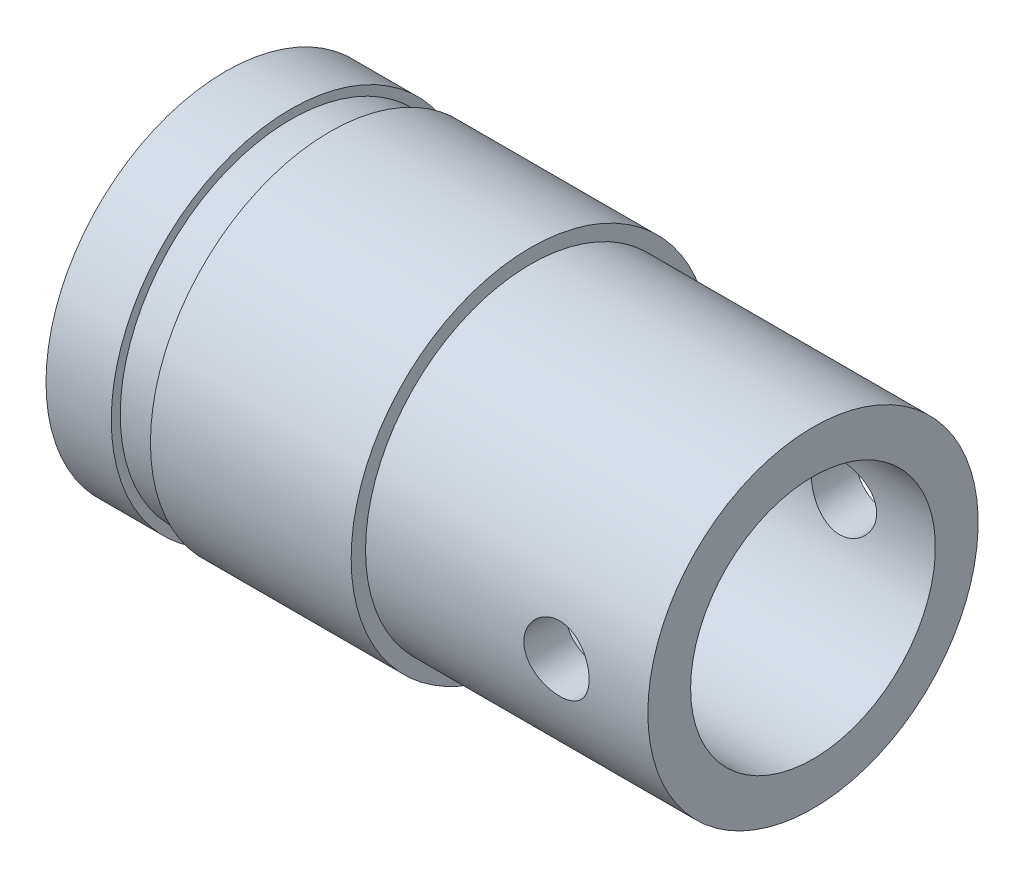
ISO-10303-21;
HEADER;
FILE_DESCRIPTION(('STEP AP214'),'2;1');
FILE_NAME('part.step','',(''),(''),'','','');
FILE_SCHEMA(('AUTOMOTIVE_DESIGN { 1 0 10303 214 1 1 1 1 }'));
ENDSEC;
DATA;
#1=APPLICATION_CONTEXT('core data for automotive mechanical design processes');
#2=APPLICATION_PROTOCOL_DEFINITION('international standard','automotive_design',2000,#1);
#3=PRODUCT_CONTEXT('',#1,'mechanical');
#4=PRODUCT('Part','Part','',(#3));
#5=PRODUCT_RELATED_PRODUCT_CATEGORY('part','',(#4));
#6=PRODUCT_DEFINITION_FORMATION('','',#4);
#7=PRODUCT_DEFINITION_CONTEXT('part definition',#1,'design');
#8=PRODUCT_DEFINITION('design','',#6,#7);
#9=PRODUCT_DEFINITION_SHAPE('','',#8);
#10=(LENGTH_UNIT() NAMED_UNIT(*) SI_UNIT(.MILLI.,.METRE.));
#11=(NAMED_UNIT(*) PLANE_ANGLE_UNIT() SI_UNIT($,.RADIAN.));
#12=(NAMED_UNIT(*) SI_UNIT($,.STERADIAN.) SOLID_ANGLE_UNIT());
#13=UNCERTAINTY_MEASURE_WITH_UNIT(LENGTH_MEASURE(1.E-05),#10,'distance_accuracy_value','');
#14=(GEOMETRIC_REPRESENTATION_CONTEXT(3) GLOBAL_UNCERTAINTY_ASSIGNED_CONTEXT((#13)) GLOBAL_UNIT_ASSIGNED_CONTEXT((#10,
#11,#12)) REPRESENTATION_CONTEXT('',''));
#15=CARTESIAN_POINT('',(0.,0.,0.));
#16=DIRECTION('',(0.,0.,1.));
#17=DIRECTION('',(1.,0.,0.));
#18=AXIS2_PLACEMENT_3D('',#15,#16,#17);
#19=CARTESIAN_POINT('',(0.,5.5,0.));
#20=DIRECTION('',(1.,0.,0.));
#21=DIRECTION('',(0.,0.,-1.));
#22=AXIS2_PLACEMENT_3D('',#19,#20,#21);
#23=PLANE('',#22);
#24=CARTESIAN_POINT('',(0.,0.,0.));
#25=DIRECTION('',(-1.,0.,0.));
#26=DIRECTION('',(0.,0.,1.));
#27=AXIS2_PLACEMENT_3D('',#24,#25,#26);
#28=CIRCLE('',#27,4.75);
#29=CARTESIAN_POINT('',(0.,0.,4.75));
#30=VERTEX_POINT('',#29);
#31=EDGE_CURVE('E10',#30,#30,#28,.T.);
#32=ORIENTED_EDGE('',*,*,#31,.F.);
#33=EDGE_LOOP('',(#32));
#34=FACE_BOUND('',#33,.T.);
#35=CARTESIAN_POINT('',(0.,0.,0.));
#36=DIRECTION('',(-1.,0.,0.));
#37=DIRECTION('',(0.,0.,1.));
#38=AXIS2_PLACEMENT_3D('',#35,#36,#37);
#39=CIRCLE('',#38,5.5);
#40=CARTESIAN_POINT('',(0.,0.,5.5));
#41=VERTEX_POINT('',#40);
#42=EDGE_CURVE('E107',#41,#41,#39,.T.);
#43=ORIENTED_EDGE('',*,*,#42,.T.);
#44=EDGE_LOOP('',(#43));
#45=FACE_BOUND('',#44,.T.);
#46=ADVANCED_FACE('F30',(#34,#45),#23,.F.);
#47=CARTESIAN_POINT('',(0.,0.,0.));
#48=DIRECTION('',(-1.,0.,0.));
#49=DIRECTION('',(0.,0.,1.));
#50=AXIS2_PLACEMENT_3D('',#47,#48,#49);
#51=CYLINDRICAL_SURFACE('',#50,4.75);
#52=CARTESIAN_POINT('',(6.1,0.,0.));
#53=DIRECTION('',(-1.,0.,0.));
#54=DIRECTION('',(0.,0.,1.));
#55=AXIS2_PLACEMENT_3D('',#52,#53,#54);
#56=CIRCLE('',#55,4.75);
#57=CARTESIAN_POINT('',(6.1,0.,4.75));
#58=VERTEX_POINT('',#57);
#59=EDGE_CURVE('E42',#58,#58,#56,.T.);
#60=ORIENTED_EDGE('',*,*,#59,.F.);
#61=EDGE_LOOP('',(#60));
#62=FACE_BOUND('',#61,.T.);
#63=ORIENTED_EDGE('',*,*,#31,.T.);
#64=EDGE_LOOP('',(#63));
#65=FACE_BOUND('',#64,.T.);
#66=ADVANCED_FACE('F92',(#62,#65),#51,.F.);
#67=CARTESIAN_POINT('',(6.1,4.75,0.));
#68=DIRECTION('',(1.,0.,0.));
#69=DIRECTION('',(0.,0.,-1.));
#70=AXIS2_PLACEMENT_3D('',#67,#68,#69);
#71=PLANE('',#70);
#72=CARTESIAN_POINT('',(6.1,0.,0.));
#73=DIRECTION('',(-1.,0.,0.));
#74=DIRECTION('',(0.,0.,1.));
#75=AXIS2_PLACEMENT_3D('',#72,#73,#74);
#76=CIRCLE('',#75,3.75);
#77=CARTESIAN_POINT('',(6.1,0.,3.75));
#78=VERTEX_POINT('',#77);
#79=EDGE_CURVE('E47',#78,#78,#76,.T.);
#80=ORIENTED_EDGE('',*,*,#79,.F.);
#81=EDGE_LOOP('',(#80));
#82=FACE_BOUND('',#81,.T.);
#83=ORIENTED_EDGE('',*,*,#59,.T.);
#84=EDGE_LOOP('',(#83));
#85=FACE_BOUND('',#84,.T.);
#86=ADVANCED_FACE('F88',(#82,#85),#71,.F.);
#87=CARTESIAN_POINT('',(0.,0.,0.));
#88=DIRECTION('',(-1.,0.,0.));
#89=DIRECTION('',(0.,0.,1.));
#90=AXIS2_PLACEMENT_3D('',#87,#88,#89);
#91=CYLINDRICAL_SURFACE('',#90,3.75);
#92=CARTESIAN_POINT('',(16.2,0.,3.75));
#93=CARTESIAN_POINT('',(16.1999986915326,0.0551272779164272,3.74999916905081));
#94=CARTESIAN_POINT('',(16.1954261929052,0.11026858011092,3.74877243081077));
#95=CARTESIAN_POINT('',(16.1772893846307,0.218962725677232,3.74399786810828));
#96=CARTESIAN_POINT('',(16.1637207477869,0.272514791659543,3.74044892666287));
#97=CARTESIAN_POINT('',(16.128064166568,0.376445794522657,3.73142166626401));
#98=CARTESIAN_POINT('',(16.105987206167,0.426828725507644,3.72594583565211));
#99=CARTESIAN_POINT('',(16.0539813786667,0.523176843196329,3.71364349575816));
#100=CARTESIAN_POINT('',(16.0240519883204,0.56914173522481,3.70681689647503));
#101=CARTESIAN_POINT('',(15.9564582417933,0.656414751870012,3.69237307451086));
#102=CARTESIAN_POINT('',(15.9186456659958,0.697605844931407,3.68474233839675));
#103=CARTESIAN_POINT('',(15.8366757584684,0.773143568303175,3.66963704839461));
#104=CARTESIAN_POINT('',(15.7925176111916,0.807489317478271,3.66216251472373));
#105=CARTESIAN_POINT('',(15.6981758825869,0.86893204621713,3.64807768733456));
#106=CARTESIAN_POINT('',(15.6479018358676,0.895894388682637,3.64148444286396));
#107=CARTESIAN_POINT('',(15.5433299444553,0.940937740384772,3.63010738654318));
#108=CARTESIAN_POINT('',(15.4890328438399,0.959020387256103,3.625323241088));
#109=CARTESIAN_POINT('',(15.3792522310867,0.985384601132128,3.61824557918659));
#110=CARTESIAN_POINT('',(15.3238232300239,0.993878351224682,3.61589823970153));
#111=CARTESIAN_POINT('',(15.2122811583335,1.00148517353046,3.61379915522345));
#112=CARTESIAN_POINT('',(15.1561682174822,1.00059999852868,3.61404692524201));
#113=CARTESIAN_POINT('',(15.0465072923138,0.989642550013106,3.61706189384523));
#114=CARTESIAN_POINT('',(14.992931408981,0.97982703032372,3.61975867751345));
#115=CARTESIAN_POINT('',(14.8882158327716,0.95169874361102,3.62725506544765));
#116=CARTESIAN_POINT('',(14.8370763349623,0.933385297465003,3.63205483777497));
#117=CARTESIAN_POINT('',(14.7380159280958,0.888571784826252,3.64327830872989));
#118=CARTESIAN_POINT('',(14.6901378303569,0.861981705688916,3.64971971409028));
#119=CARTESIAN_POINT('',(14.5994329205742,0.801432519118897,3.66349114821545));
#120=CARTESIAN_POINT('',(14.5566071054218,0.76747196112126,3.67082135177681));
#121=CARTESIAN_POINT('',(14.4757555012726,0.691833036317094,3.68583755314841));
#122=CARTESIAN_POINT('',(14.4379318408425,0.649939063641496,3.69352735744391));
#123=CARTESIAN_POINT('',(14.3698056098249,0.560308834103188,3.70818190638182));
#124=CARTESIAN_POINT('',(14.3395033356488,0.512572347102546,3.71514662244284));
#125=CARTESIAN_POINT('',(14.2871910485877,0.412299127748726,3.7276091019914));
#126=CARTESIAN_POINT('',(14.2652176147757,0.359742451275895,3.73310036416778));
#127=CARTESIAN_POINT('',(14.2304764055933,0.251501147195198,3.74195022200501));
#128=CARTESIAN_POINT('',(14.217706618638,0.195817205964161,3.74530928366875));
#129=CARTESIAN_POINT('',(14.2020525615411,0.0846270415727573,3.74944579279192));
#130=CARTESIAN_POINT('',(14.1988934800746,0.0291621188206898,3.75029498735481));
#131=CARTESIAN_POINT('',(14.2017915821235,-0.0815050229505989,3.74952235845846));
#132=CARTESIAN_POINT('',(14.2078478130529,-0.136707268531056,3.74790079040171));
#133=CARTESIAN_POINT('',(14.22877922373,-0.244301224950891,3.74241517748015));
#134=CARTESIAN_POINT('',(14.2435011230989,-0.296724926013895,3.73859013273183));
#135=CARTESIAN_POINT('',(14.281167972254,-0.398353485588028,3.72913147447051));
#136=CARTESIAN_POINT('',(14.3041138131252,-0.447557994607999,3.72349766498012));
#137=CARTESIAN_POINT('',(14.3580869435903,-0.542419237333991,3.71087830279834));
#138=CARTESIAN_POINT('',(14.389263733399,-0.587987594230651,3.70386843302742));
#139=CARTESIAN_POINT('',(14.4586258150788,-0.673342317698515,3.68930726182519));
#140=CARTESIAN_POINT('',(14.4968124912999,-0.713127539399372,3.68175585362777));
#141=CARTESIAN_POINT('',(14.5803927887479,-0.786944622394094,3.66669872934363));
#142=CARTESIAN_POINT('',(14.6259592807001,-0.82078259624993,3.65920030718477));
#143=CARTESIAN_POINT('',(14.7222823480473,-0.880335955924744,3.64533223587543));
#144=CARTESIAN_POINT('',(14.7730387068019,-0.906051680607636,3.63896253963886));
#145=CARTESIAN_POINT('',(14.8780476535441,-0.948437057932432,3.62814634200825));
#146=CARTESIAN_POINT('',(14.9322779059366,-0.965159061279489,3.62368874211867));
#147=CARTESIAN_POINT('',(15.0429196598669,-0.989206025603967,3.61719912616095));
#148=CARTESIAN_POINT('',(15.0993306001835,-0.996533388014941,3.6151664902391));
#149=CARTESIAN_POINT('',(15.2107473939363,-1.00144494826627,3.61380872273343));
#150=CARTESIAN_POINT('',(15.2657386601276,-0.999340778089927,3.61439698868016));
#151=CARTESIAN_POINT('',(15.3745517570065,-0.986171880002813,3.61801198044147));
#152=CARTESIAN_POINT('',(15.4283736177507,-0.975107382675293,3.62103864350681));
#153=CARTESIAN_POINT('',(15.5329278760645,-0.944512578498334,3.62913785535624));
#154=CARTESIAN_POINT('',(15.583680921366,-0.925048305377857,3.63419442509566));
#155=CARTESIAN_POINT('',(15.6812394152672,-0.878257772811975,3.64578409068345));
#156=CARTESIAN_POINT('',(15.7280442431503,-0.850930280123096,3.65231741810751));
#157=CARTESIAN_POINT('',(15.8178651797483,-0.788244546344072,3.66636460720159));
#158=CARTESIAN_POINT('',(15.8607292674881,-0.752673648839545,3.67390166550826));
#159=CARTESIAN_POINT('',(15.9399812258337,-0.674915267555504,3.68897751891523));
#160=CARTESIAN_POINT('',(15.9763675193344,-0.632726177179375,3.69651631399226));
#161=CARTESIAN_POINT('',(16.0423961188234,-0.541839990544342,3.71093906201979));
#162=CARTESIAN_POINT('',(16.0718775053247,-0.49302298087589,3.71780555657274));
#163=CARTESIAN_POINT('',(16.1221687079647,-0.390944320208445,3.7299190505145));
#164=CARTESIAN_POINT('',(16.1429840878318,-0.337685547348149,3.73516708841797));
#165=CARTESIAN_POINT('',(16.1726376427078,-0.237187352440496,3.74277376256734));
#166=CARTESIAN_POINT('',(16.1828746917962,-0.190381008282518,3.74546385296301));
#167=CARTESIAN_POINT('',(16.1965561030835,-0.0957198976585382,3.74907724518228));
#168=CARTESIAN_POINT('',(16.2000011361,-0.0478652352024302,3.75000072148635));
#169=CARTESIAN_POINT('',(16.2,0.,3.75));
#170=B_SPLINE_CURVE_WITH_KNOTS('',3,(#92,#93,#94,#95,#96,#97,#98,#99,#100,#101,#102,#103,#104,
#105,#106,#107,#108,#109,#110,#111,#112,#113,#114,#115,#116,#117,#118,#119,#120,#121,#122,#123,
#124,#125,#126,#127,#128,#129,#130,#131,#132,#133,#134,#135,#136,#137,#138,#139,#140,#141,#142,
#143,#144,#145,#146,#147,#148,#149,#150,#151,#152,#153,#154,#155,#156,#157,#158,#159,#160,#161,
#162,#163,#164,#165,#166,#167,#168,#169),.UNSPECIFIED.,.T.,.F.,(4,2,2,2,2,2,2,2,2,2,2,2,2,2,2,2,
2,2,2,2,2,2,2,2,2,2,2,2,2,2,2,2,2,2,2,2,2,2,4),(0.,0.165206299474785,0.330492121880725,
0.495565276485966,0.660649433543376,0.829174489774837,0.997721224625745,1.16916291261615,
1.3405729706485,1.50811079123795,1.67561730199242,1.83845501020081,2.00130573403552,
2.16599336670331,2.33071344055897,2.50080629903243,2.67090585965881,2.84174404798603,
3.01254488592152,3.17841358759356,3.34426514459758,3.5072676781814,3.6702878788489,
3.83650142999358,4.00274784126526,4.17368248188477,4.34460999009136,4.51453148845744,
4.68440954326914,4.84871671196728,5.01301965255219,5.17605382719074,5.33911358556424,
5.50697169780617,5.67487062161147,5.84636126135371,6.01774163067513,6.16119909491591,
6.30464238978114),.UNSPECIFIED.);
#171=CARTESIAN_POINT('',(16.2,0.,3.75));
#172=VERTEX_POINT('',#171);
#173=EDGE_CURVE('E78',#172,#172,#170,.T.);
#174=ORIENTED_EDGE('',*,*,#173,.T.);
#175=EDGE_LOOP('',(#174));
#176=FACE_BOUND('',#175,.T.);
#177=CARTESIAN_POINT('',(16.2,0.,-3.75));
#178=CARTESIAN_POINT('',(16.1999986915326,-0.0551272779164272,-3.74999916905081));
#179=CARTESIAN_POINT('',(16.1954261929052,-0.11026858011092,-3.74877243081077));
#180=CARTESIAN_POINT('',(16.1772893846307,-0.218962725677232,-3.74399786810828));
#181=CARTESIAN_POINT('',(16.1637207477869,-0.272514791659543,-3.74044892666287));
#182=CARTESIAN_POINT('',(16.128064166568,-0.376445794522657,-3.73142166626401));
#183=CARTESIAN_POINT('',(16.105987206167,-0.426828725507644,-3.72594583565211));
#184=CARTESIAN_POINT('',(16.0539813786667,-0.523176843196329,-3.71364349575816));
#185=CARTESIAN_POINT('',(16.0240519883204,-0.56914173522481,-3.70681689647503));
#186=CARTESIAN_POINT('',(15.9564582417933,-0.656414751870012,-3.69237307451086));
#187=CARTESIAN_POINT('',(15.9186456659958,-0.697605844931407,-3.68474233839675));
#188=CARTESIAN_POINT('',(15.8366757584684,-0.773143568303175,-3.66963704839461));
#189=CARTESIAN_POINT('',(15.7925176111916,-0.807489317478271,-3.66216251472373));
#190=CARTESIAN_POINT('',(15.6981758825869,-0.86893204621713,-3.64807768733456));
#191=CARTESIAN_POINT('',(15.6479018358676,-0.895894388682637,-3.64148444286396));
#192=CARTESIAN_POINT('',(15.5433299444553,-0.940937740384772,-3.63010738654318));
#193=CARTESIAN_POINT('',(15.4890328438399,-0.959020387256103,-3.625323241088));
#194=CARTESIAN_POINT('',(15.3792522310867,-0.985384601132128,-3.61824557918659));
#195=CARTESIAN_POINT('',(15.3238232300239,-0.993878351224682,-3.61589823970153));
#196=CARTESIAN_POINT('',(15.2122811583335,-1.00148517353046,-3.61379915522345));
#197=CARTESIAN_POINT('',(15.1561682174822,-1.00059999852868,-3.61404692524201));
#198=CARTESIAN_POINT('',(15.0465072923138,-0.989642550013106,-3.61706189384523));
#199=CARTESIAN_POINT('',(14.992931408981,-0.97982703032372,-3.61975867751345));
#200=CARTESIAN_POINT('',(14.8882158327716,-0.95169874361102,-3.62725506544765));
#201=CARTESIAN_POINT('',(14.8370763349623,-0.933385297465003,-3.63205483777497));
#202=CARTESIAN_POINT('',(14.7380159280958,-0.888571784826252,-3.64327830872989));
#203=CARTESIAN_POINT('',(14.6901378303569,-0.861981705688916,-3.64971971409028));
#204=CARTESIAN_POINT('',(14.5994329205742,-0.801432519118897,-3.66349114821545));
#205=CARTESIAN_POINT('',(14.5566071054218,-0.76747196112126,-3.67082135177681));
#206=CARTESIAN_POINT('',(14.4757555012726,-0.691833036317094,-3.68583755314841));
#207=CARTESIAN_POINT('',(14.4379318408425,-0.649939063641496,-3.69352735744391));
#208=CARTESIAN_POINT('',(14.3698056098249,-0.560308834103188,-3.70818190638182));
#209=CARTESIAN_POINT('',(14.3395033356488,-0.512572347102546,-3.71514662244284));
#210=CARTESIAN_POINT('',(14.2871910485877,-0.412299127748726,-3.7276091019914));
#211=CARTESIAN_POINT('',(14.2652176147757,-0.359742451275895,-3.73310036416778));
#212=CARTESIAN_POINT('',(14.2304764055933,-0.251501147195198,-3.74195022200501));
#213=CARTESIAN_POINT('',(14.217706618638,-0.195817205964161,-3.74530928366875));
#214=CARTESIAN_POINT('',(14.2020525615411,-0.0846270415727573,-3.74944579279192));
#215=CARTESIAN_POINT('',(14.1988934800746,-0.0291621188206898,-3.75029498735481));
#216=CARTESIAN_POINT('',(14.2017915821235,0.0815050229505989,-3.74952235845846));
#217=CARTESIAN_POINT('',(14.2078478130529,0.136707268531056,-3.74790079040171));
#218=CARTESIAN_POINT('',(14.22877922373,0.244301224950891,-3.74241517748015));
#219=CARTESIAN_POINT('',(14.2435011230989,0.296724926013895,-3.73859013273183));
#220=CARTESIAN_POINT('',(14.281167972254,0.398353485588028,-3.72913147447051));
#221=CARTESIAN_POINT('',(14.3041138131252,0.447557994607999,-3.72349766498012));
#222=CARTESIAN_POINT('',(14.3580869435903,0.542419237333991,-3.71087830279834));
#223=CARTESIAN_POINT('',(14.389263733399,0.587987594230651,-3.70386843302742));
#224=CARTESIAN_POINT('',(14.4586258150788,0.673342317698515,-3.68930726182519));
#225=CARTESIAN_POINT('',(14.4968124912999,0.713127539399372,-3.68175585362777));
#226=CARTESIAN_POINT('',(14.5803927887479,0.786944622394094,-3.66669872934363));
#227=CARTESIAN_POINT('',(14.6259592807001,0.82078259624993,-3.65920030718477));
#228=CARTESIAN_POINT('',(14.7222823480473,0.880335955924744,-3.64533223587543));
#229=CARTESIAN_POINT('',(14.7730387068019,0.906051680607636,-3.63896253963886));
#230=CARTESIAN_POINT('',(14.8780476535441,0.948437057932432,-3.62814634200825));
#231=CARTESIAN_POINT('',(14.9322779059366,0.965159061279489,-3.62368874211867));
#232=CARTESIAN_POINT('',(15.0429196598669,0.989206025603967,-3.61719912616095));
#233=CARTESIAN_POINT('',(15.0993306001835,0.996533388014941,-3.6151664902391));
#234=CARTESIAN_POINT('',(15.2107473939363,1.00144494826627,-3.61380872273343));
#235=CARTESIAN_POINT('',(15.2657386601276,0.999340778089927,-3.61439698868016));
#236=CARTESIAN_POINT('',(15.3745517570065,0.986171880002813,-3.61801198044147));
#237=CARTESIAN_POINT('',(15.4283736177507,0.975107382675293,-3.62103864350681));
#238=CARTESIAN_POINT('',(15.5329278760645,0.944512578498334,-3.62913785535624));
#239=CARTESIAN_POINT('',(15.583680921366,0.925048305377857,-3.63419442509566));
#240=CARTESIAN_POINT('',(15.6812394152672,0.878257772811975,-3.64578409068345));
#241=CARTESIAN_POINT('',(15.7280442431503,0.850930280123096,-3.65231741810751));
#242=CARTESIAN_POINT('',(15.8178651797483,0.788244546344072,-3.66636460720159));
#243=CARTESIAN_POINT('',(15.8607292674881,0.752673648839545,-3.67390166550826));
#244=CARTESIAN_POINT('',(15.9399812258337,0.674915267555504,-3.68897751891523));
#245=CARTESIAN_POINT('',(15.9763675193344,0.632726177179375,-3.69651631399226));
#246=CARTESIAN_POINT('',(16.0423961188234,0.541839990544342,-3.71093906201979));
#247=CARTESIAN_POINT('',(16.0718775053247,0.49302298087589,-3.71780555657274));
#248=CARTESIAN_POINT('',(16.1221687079647,0.390944320208445,-3.7299190505145));
#249=CARTESIAN_POINT('',(16.1429840878318,0.337685547348149,-3.73516708841797));
#250=CARTESIAN_POINT('',(16.1726376427078,0.237187352440496,-3.74277376256734));
#251=CARTESIAN_POINT('',(16.1828746917962,0.190381008282518,-3.74546385296301));
#252=CARTESIAN_POINT('',(16.1965561030835,0.0957198976585382,-3.74907724518228));
#253=CARTESIAN_POINT('',(16.2000011361,0.0478652352024302,-3.75000072148635));
#254=CARTESIAN_POINT('',(16.2,0.,-3.75));
#255=B_SPLINE_CURVE_WITH_KNOTS('',3,(#177,#178,#179,#180,#181,#182,#183,#184,#185,#186,#187,
#188,#189,#190,#191,#192,#193,#194,#195,#196,#197,#198,#199,#200,#201,#202,#203,#204,#205,#206,
#207,#208,#209,#210,#211,#212,#213,#214,#215,#216,#217,#218,#219,#220,#221,#222,#223,#224,#225,
#226,#227,#228,#229,#230,#231,#232,#233,#234,#235,#236,#237,#238,#239,#240,#241,#242,#243,#244,
#245,#246,#247,#248,#249,#250,#251,#252,#253,#254),.UNSPECIFIED.,.T.,.F.,(4,2,2,2,2,2,2,2,2,2,2,
2,2,2,2,2,2,2,2,2,2,2,2,2,2,2,2,2,2,2,2,2,2,2,2,2,2,2,4),(0.,0.165206299474785,
0.330492121880725,0.495565276485966,0.660649433543376,0.829174489774837,0.997721224625745,
1.16916291261615,1.3405729706485,1.50811079123795,1.67561730199242,1.83845501020081,
2.00130573403552,2.16599336670331,2.33071344055897,2.50080629903243,2.67090585965881,
2.84174404798603,3.01254488592152,3.17841358759356,3.34426514459758,3.5072676781814,
3.6702878788489,3.83650142999358,4.00274784126526,4.17368248188477,4.34460999009136,
4.51453148845744,4.68440954326914,4.84871671196728,5.01301965255219,5.17605382719074,
5.33911358556424,5.50697169780617,5.67487062161147,5.84636126135371,6.01774163067513,
6.16119909491591,6.30464238978114),.UNSPECIFIED.);
#256=CARTESIAN_POINT('',(16.2,0.,-3.75));
#257=VERTEX_POINT('',#256);
#258=EDGE_CURVE('E72',#257,#257,#255,.T.);
#259=ORIENTED_EDGE('',*,*,#258,.T.);
#260=EDGE_LOOP('',(#259));
#261=FACE_BOUND('',#260,.T.);
#262=CARTESIAN_POINT('',(18.,0.,0.));
#263=DIRECTION('',(-1.,0.,0.));
#264=DIRECTION('',(0.,0.,1.));
#265=AXIS2_PLACEMENT_3D('',#262,#263,#264);
#266=CIRCLE('',#265,3.75);
#267=CARTESIAN_POINT('',(18.,0.,3.75));
#268=VERTEX_POINT('',#267);
#269=EDGE_CURVE('E132',#268,#268,#266,.T.);
#270=ORIENTED_EDGE('',*,*,#269,.F.);
#271=EDGE_LOOP('',(#270));
#272=FACE_BOUND('',#271,.T.);
#273=ORIENTED_EDGE('',*,*,#79,.T.);
#274=EDGE_LOOP('',(#273));
#275=FACE_BOUND('',#274,.T.);
#276=ADVANCED_FACE('F83',(#176,#261,#272,#275),#91,.F.);
#277=CARTESIAN_POINT('',(18.,5.06,0.));
#278=DIRECTION('',(-1.,0.,0.));
#279=DIRECTION('',(0.,0.,1.));
#280=AXIS2_PLACEMENT_3D('',#277,#278,#279);
#281=PLANE('',#280);
#282=CARTESIAN_POINT('',(18.,0.,0.));
#283=DIRECTION('',(-1.,0.,0.));
#284=DIRECTION('',(0.,0.,1.));
#285=AXIS2_PLACEMENT_3D('',#282,#283,#284);
#286=CIRCLE('',#285,5.06);
#287=CARTESIAN_POINT('',(18.,0.,5.06));
#288=VERTEX_POINT('',#287);
#289=EDGE_CURVE('E129',#288,#288,#286,.T.);
#290=ORIENTED_EDGE('',*,*,#289,.F.);
#291=EDGE_LOOP('',(#290));
#292=FACE_BOUND('',#291,.T.);
#293=ORIENTED_EDGE('',*,*,#269,.T.);
#294=EDGE_LOOP('',(#293));
#295=FACE_BOUND('',#294,.T.);
#296=ADVANCED_FACE('F87',(#292,#295),#281,.F.);
#297=CARTESIAN_POINT('',(0.,0.,0.));
#298=DIRECTION('',(-1.,0.,0.));
#299=DIRECTION('',(0.,0.,1.));
#300=AXIS2_PLACEMENT_3D('',#297,#298,#299);
#301=CYLINDRICAL_SURFACE('',#300,5.06);
#302=CARTESIAN_POINT('',(16.2,0.,5.06));
#303=CARTESIAN_POINT('',(16.1999979389095,-0.0555906945597344,5.05999897794759));
#304=CARTESIAN_POINT('',(16.1953488494003,-0.111207590459503,5.05907448228286));
#305=CARTESIAN_POINT('',(16.1768895514314,-0.220870256829647,5.05547564686027));
#306=CARTESIAN_POINT('',(16.1630719767116,-0.274914727487628,5.05279990011376));
#307=CARTESIAN_POINT('',(16.1267184742682,-0.379831066863929,5.04599745131192));
#308=CARTESIAN_POINT('',(16.1041908049024,-0.430705887947223,5.0418721239935));
#309=CARTESIAN_POINT('',(16.0510809211097,-0.527950029347185,5.03261936847929));
#310=CARTESIAN_POINT('',(16.0204992196517,-0.574319636347752,5.02749200410954));
#311=CARTESIAN_POINT('',(15.9517200385112,-0.661854716381776,5.01672390889709));
#312=CARTESIAN_POINT('',(15.9134365368711,-0.702951945655416,5.01107781071616));
#313=CARTESIAN_POINT('',(15.8305254270377,-0.778184860859798,4.99994779921208));
#314=CARTESIAN_POINT('',(15.785897331756,-0.812320011806256,4.99446389838026));
#315=CARTESIAN_POINT('',(15.6910746476294,-0.872948985179414,4.98422682444934));
#316=CARTESIAN_POINT('',(15.6408342197093,-0.899372385725853,4.97948056010937));
#317=CARTESIAN_POINT('',(15.536517542434,-0.943376712238143,4.97133225925974));
#318=CARTESIAN_POINT('',(15.4824416631526,-0.960958489990928,4.96793009326869));
#319=CARTESIAN_POINT('',(15.3727225598562,-0.986559432575588,4.96290944452544));
#320=CARTESIAN_POINT('',(15.3171082817878,-0.99469819277353,4.96126867416454));
#321=CARTESIAN_POINT('',(15.2052812594245,-1.00155349484653,4.95988948455443));
#322=CARTESIAN_POINT('',(15.1490685754115,-1.00027097699385,4.96015087546371));
#323=CARTESIAN_POINT('',(15.0385137341171,-0.988416877896195,4.96252621655088));
#324=CARTESIAN_POINT('',(14.9841562257516,-0.977982180483026,4.96461286616291));
#325=CARTESIAN_POINT('',(14.8779788533,-0.948335894720332,4.97036064555418));
#326=CARTESIAN_POINT('',(14.8261591079459,-0.929123896148838,4.97402184892238));
#327=CARTESIAN_POINT('',(14.7261325794707,-0.882337048246683,4.98253424406827));
#328=CARTESIAN_POINT('',(14.6779519494445,-0.854707746110742,4.98739314364286));
#329=CARTESIAN_POINT('',(14.5868594257703,-0.791909023608378,4.99774847851966));
#330=CARTESIAN_POINT('',(14.5439481247731,-0.756738756315684,5.00324498539972));
#331=CARTESIAN_POINT('',(14.4638223018725,-0.679122568087603,5.01437462201145));
#332=CARTESIAN_POINT('',(14.4267210025759,-0.636559769027067,5.02000845632246));
#333=CARTESIAN_POINT('',(14.3601670146314,-0.54575564192369,5.03068954281501));
#334=CARTESIAN_POINT('',(14.3307144196956,-0.497514244317024,5.03573678780921));
#335=CARTESIAN_POINT('',(14.2802737776025,-0.396598039106544,5.0446879661777));
#336=CARTESIAN_POINT('',(14.2592984463177,-0.3439167136091,5.04859017962363));
#337=CARTESIAN_POINT('',(14.2265272455642,-0.23568376805859,5.05479852332872));
#338=CARTESIAN_POINT('',(14.2147302908138,-0.180132488187057,5.05710484228817));
#339=CARTESIAN_POINT('',(14.2008104866011,-0.0687097146178003,5.05983532776052));
#340=CARTESIAN_POINT('',(14.1985326545199,-0.0128582983778169,5.06028964404691));
#341=CARTESIAN_POINT('',(14.2032986904246,0.098427136089409,5.05934858931145));
#342=CARTESIAN_POINT('',(14.2103420473001,0.153861177035056,5.0579533197083));
#343=CARTESIAN_POINT('',(14.2334217484137,0.262239940680893,5.05348871623005));
#344=CARTESIAN_POINT('',(14.2493787847058,0.315202214082903,5.05043415215704));
#345=CARTESIAN_POINT('',(14.2897463823723,0.417699454824389,5.04299218108633));
#346=CARTESIAN_POINT('',(14.3141575658774,0.467234169611937,5.03860467600199));
#347=CARTESIAN_POINT('',(14.3710772981719,0.56212532317486,5.02890839439706));
#348=CARTESIAN_POINT('',(14.4036794256395,0.60742454286061,5.0235892025125));
#349=CARTESIAN_POINT('',(14.4759300344245,0.69196477762851,5.01264452311388));
#350=CARTESIAN_POINT('',(14.5155792521468,0.7312051587743,5.00701900363196));
#351=CARTESIAN_POINT('',(14.6015033346755,0.803110186128542,4.99599438266471));
#352=CARTESIAN_POINT('',(14.6478678281511,0.835668555778562,4.99059988269367));
#353=CARTESIAN_POINT('',(14.7454987733408,0.892535483403059,4.98074460044953));
#354=CARTESIAN_POINT('',(14.7967650313043,0.916844367279858,4.97628378129334));
#355=CARTESIAN_POINT('',(14.9024888072563,0.956376096870276,4.96883789089641));
#356=CARTESIAN_POINT('',(14.9569283775294,0.971645454211562,4.96584527908294));
#357=CARTESIAN_POINT('',(15.0676657734908,0.992806237425707,4.96165841321158));
#358=CARTESIAN_POINT('',(15.1239633623556,0.99869885378444,4.96046393086136));
#359=CARTESIAN_POINT('',(15.2357521744227,1.00089564051878,4.96002103095288));
#360=CARTESIAN_POINT('',(15.2912400320179,0.997367686675284,4.9607385409713));
#361=CARTESIAN_POINT('',(15.4008147464238,0.981193408260127,4.96396276441812));
#362=CARTESIAN_POINT('',(15.4549016139013,0.96854715313419,4.96646946421992));
#363=CARTESIAN_POINT('',(15.5600354115972,0.934569361556118,4.97297456174403));
#364=CARTESIAN_POINT('',(15.6110890718852,0.913257944390111,4.97696950219293));
#365=CARTESIAN_POINT('',(15.7089225450325,0.862573867703988,4.98600301499887));
#366=CARTESIAN_POINT('',(15.7557020099293,0.833200552642279,4.99104167221604));
#367=CARTESIAN_POINT('',(15.8444960976846,0.766651107714259,5.00169943661389));
#368=CARTESIAN_POINT('',(15.8864187451695,0.7293535577187,5.007326790056));
#369=CARTESIAN_POINT('',(15.9634659277081,0.64826556070805,5.01846821896905));
#370=CARTESIAN_POINT('',(15.9985888987242,0.604473623958027,5.02398226811804));
#371=CARTESIAN_POINT('',(16.0613765276259,0.511104753830317,5.03434189966786));
#372=CARTESIAN_POINT('',(16.0889616569926,0.461473489595557,5.039180109176));
#373=CARTESIAN_POINT('',(16.1353566924637,0.358198742614853,5.04757048017585));
#374=CARTESIAN_POINT('',(16.1541745731005,0.304558957693533,5.05112380971004));
#375=CARTESIAN_POINT('',(16.1788220553729,0.208992742545965,5.05584709115023));
#376=CARTESIAN_POINT('',(16.1867497403333,0.167613289338453,5.05739538046069));
#377=CARTESIAN_POINT('',(16.1973394124564,0.0841608828679762,5.05947220621147));
#378=CARTESIAN_POINT('',(16.2000015604603,0.0420879508276195,5.06000077380021));
#379=CARTESIAN_POINT('',(16.2,0.,5.06));
#380=B_SPLINE_CURVE_WITH_KNOTS('',3,(#302,#303,#304,#305,#306,#307,#308,#309,#310,#311,#312,
#313,#314,#315,#316,#317,#318,#319,#320,#321,#322,#323,#324,#325,#326,#327,#328,#329,#330,#331,
#332,#333,#334,#335,#336,#337,#338,#339,#340,#341,#342,#343,#344,#345,#346,#347,#348,#349,#350,
#351,#352,#353,#354,#355,#356,#357,#358,#359,#360,#361,#362,#363,#364,#365,#366,#367,#368,#369,
#370,#371,#372,#373,#374,#375,#376,#377,#378,#379),.UNSPECIFIED.,.T.,.F.,(4,2,2,2,2,2,2,2,2,2,2,
2,2,2,2,2,2,2,2,2,2,2,2,2,2,2,2,2,2,2,2,2,2,2,2,2,2,2,4),(0.,0.166618123538423,
0.333370275865862,0.499964710592942,0.666548537330136,0.835108058838139,1.00368052802411,
1.17374736929592,1.34379782347671,1.51167024120611,1.67952590498449,1.84491305637591,
2.01030793820553,2.17679636115717,2.34330349223744,2.51273345558899,2.68216549470323,
2.85185074648464,3.0215159310687,3.18840773671864,3.35529039153709,3.520711357739,
3.68614449966118,3.85356119866434,4.02099540262619,4.19091543150298,4.36082874677582,
4.52986002197801,4.69886983498924,4.86488805926665,5.0309050191491,5.19653869242223,
5.36218583795067,5.53058242317498,5.69901769649007,5.86916687866309,6.0391609925754,
6.16531213465771,6.29145942326444),.UNSPECIFIED.);
#381=CARTESIAN_POINT('',(16.2,0.,5.06));
#382=VERTEX_POINT('',#381);
#383=EDGE_CURVE('E33',#382,#382,#380,.T.);
#384=ORIENTED_EDGE('',*,*,#383,.T.);
#385=EDGE_LOOP('',(#384));
#386=FACE_BOUND('',#385,.T.);
#387=CARTESIAN_POINT('',(16.2,0.,-5.06));
#388=CARTESIAN_POINT('',(16.1999979389095,0.0555906945597344,-5.05999897794759));
#389=CARTESIAN_POINT('',(16.1953488494003,0.111207590459503,-5.05907448228286));
#390=CARTESIAN_POINT('',(16.1768895514314,0.220870256829647,-5.05547564686027));
#391=CARTESIAN_POINT('',(16.1630719767116,0.274914727487628,-5.05279990011376));
#392=CARTESIAN_POINT('',(16.1267184742682,0.379831066863929,-5.04599745131192));
#393=CARTESIAN_POINT('',(16.1041908049024,0.430705887947223,-5.0418721239935));
#394=CARTESIAN_POINT('',(16.0510809211097,0.527950029347185,-5.03261936847929));
#395=CARTESIAN_POINT('',(16.0204992196517,0.574319636347752,-5.02749200410954));
#396=CARTESIAN_POINT('',(15.9517200385112,0.661854716381776,-5.01672390889709));
#397=CARTESIAN_POINT('',(15.9134365368711,0.702951945655416,-5.01107781071616));
#398=CARTESIAN_POINT('',(15.8305254270377,0.778184860859798,-4.99994779921208));
#399=CARTESIAN_POINT('',(15.785897331756,0.812320011806256,-4.99446389838026));
#400=CARTESIAN_POINT('',(15.6910746476294,0.872948985179414,-4.98422682444934));
#401=CARTESIAN_POINT('',(15.6408342197093,0.899372385725853,-4.97948056010937));
#402=CARTESIAN_POINT('',(15.536517542434,0.943376712238143,-4.97133225925974));
#403=CARTESIAN_POINT('',(15.4824416631526,0.960958489990928,-4.96793009326869));
#404=CARTESIAN_POINT('',(15.3727225598562,0.986559432575588,-4.96290944452544));
#405=CARTESIAN_POINT('',(15.3171082817878,0.99469819277353,-4.96126867416454));
#406=CARTESIAN_POINT('',(15.2052812594245,1.00155349484653,-4.95988948455443));
#407=CARTESIAN_POINT('',(15.1490685754115,1.00027097699385,-4.96015087546371));
#408=CARTESIAN_POINT('',(15.0385137341171,0.988416877896195,-4.96252621655088));
#409=CARTESIAN_POINT('',(14.9841562257516,0.977982180483026,-4.96461286616291));
#410=CARTESIAN_POINT('',(14.8779788533,0.948335894720332,-4.97036064555418));
#411=CARTESIAN_POINT('',(14.8261591079459,0.929123896148838,-4.97402184892238));
#412=CARTESIAN_POINT('',(14.7261325794707,0.882337048246683,-4.98253424406827));
#413=CARTESIAN_POINT('',(14.6779519494445,0.854707746110742,-4.98739314364286));
#414=CARTESIAN_POINT('',(14.5868594257703,0.791909023608378,-4.99774847851966));
#415=CARTESIAN_POINT('',(14.5439481247731,0.756738756315684,-5.00324498539972));
#416=CARTESIAN_POINT('',(14.4638223018725,0.679122568087603,-5.01437462201145));
#417=CARTESIAN_POINT('',(14.4267210025759,0.636559769027067,-5.02000845632246));
#418=CARTESIAN_POINT('',(14.3601670146314,0.54575564192369,-5.03068954281501));
#419=CARTESIAN_POINT('',(14.3307144196956,0.497514244317024,-5.03573678780921));
#420=CARTESIAN_POINT('',(14.2802737776025,0.396598039106544,-5.0446879661777));
#421=CARTESIAN_POINT('',(14.2592984463177,0.3439167136091,-5.04859017962363));
#422=CARTESIAN_POINT('',(14.2265272455642,0.23568376805859,-5.05479852332872));
#423=CARTESIAN_POINT('',(14.2147302908138,0.180132488187057,-5.05710484228817));
#424=CARTESIAN_POINT('',(14.2008104866011,0.0687097146178003,-5.05983532776052));
#425=CARTESIAN_POINT('',(14.1985326545199,0.0128582983778169,-5.06028964404691));
#426=CARTESIAN_POINT('',(14.2032986904246,-0.098427136089409,-5.05934858931145));
#427=CARTESIAN_POINT('',(14.2103420473001,-0.153861177035056,-5.0579533197083));
#428=CARTESIAN_POINT('',(14.2334217484137,-0.262239940680893,-5.05348871623005));
#429=CARTESIAN_POINT('',(14.2493787847058,-0.315202214082903,-5.05043415215704));
#430=CARTESIAN_POINT('',(14.2897463823723,-0.417699454824389,-5.04299218108633));
#431=CARTESIAN_POINT('',(14.3141575658774,-0.467234169611937,-5.03860467600199));
#432=CARTESIAN_POINT('',(14.3710772981719,-0.56212532317486,-5.02890839439706));
#433=CARTESIAN_POINT('',(14.4036794256395,-0.60742454286061,-5.0235892025125));
#434=CARTESIAN_POINT('',(14.4759300344245,-0.69196477762851,-5.01264452311388));
#435=CARTESIAN_POINT('',(14.5155792521468,-0.7312051587743,-5.00701900363196));
#436=CARTESIAN_POINT('',(14.6015033346755,-0.803110186128542,-4.99599438266471));
#437=CARTESIAN_POINT('',(14.6478678281511,-0.835668555778562,-4.99059988269367));
#438=CARTESIAN_POINT('',(14.7454987733408,-0.892535483403059,-4.98074460044953));
#439=CARTESIAN_POINT('',(14.7967650313043,-0.916844367279858,-4.97628378129334));
#440=CARTESIAN_POINT('',(14.9024888072563,-0.956376096870276,-4.96883789089641));
#441=CARTESIAN_POINT('',(14.9569283775294,-0.971645454211562,-4.96584527908294));
#442=CARTESIAN_POINT('',(15.0676657734908,-0.992806237425707,-4.96165841321158));
#443=CARTESIAN_POINT('',(15.1239633623556,-0.99869885378444,-4.96046393086136));
#444=CARTESIAN_POINT('',(15.2357521744227,-1.00089564051878,-4.96002103095288));
#445=CARTESIAN_POINT('',(15.2912400320179,-0.997367686675284,-4.9607385409713));
#446=CARTESIAN_POINT('',(15.4008147464238,-0.981193408260127,-4.96396276441812));
#447=CARTESIAN_POINT('',(15.4549016139013,-0.96854715313419,-4.96646946421992));
#448=CARTESIAN_POINT('',(15.5600354115972,-0.934569361556118,-4.97297456174403));
#449=CARTESIAN_POINT('',(15.6110890718852,-0.913257944390111,-4.97696950219293));
#450=CARTESIAN_POINT('',(15.7089225450325,-0.862573867703988,-4.98600301499887));
#451=CARTESIAN_POINT('',(15.7557020099293,-0.833200552642279,-4.99104167221604));
#452=CARTESIAN_POINT('',(15.8444960976846,-0.766651107714259,-5.00169943661389));
#453=CARTESIAN_POINT('',(15.8864187451695,-0.7293535577187,-5.007326790056));
#454=CARTESIAN_POINT('',(15.9634659277081,-0.64826556070805,-5.01846821896905));
#455=CARTESIAN_POINT('',(15.9985888987242,-0.604473623958027,-5.02398226811804));
#456=CARTESIAN_POINT('',(16.0613765276259,-0.511104753830317,-5.03434189966786));
#457=CARTESIAN_POINT('',(16.0889616569926,-0.461473489595557,-5.039180109176));
#458=CARTESIAN_POINT('',(16.1353566924637,-0.358198742614853,-5.04757048017585));
#459=CARTESIAN_POINT('',(16.1541745731005,-0.304558957693533,-5.05112380971004));
#460=CARTESIAN_POINT('',(16.1788220553729,-0.208992742545965,-5.05584709115023));
#461=CARTESIAN_POINT('',(16.1867497403333,-0.167613289338453,-5.05739538046069));
#462=CARTESIAN_POINT('',(16.1973394124564,-0.0841608828679762,-5.05947220621147));
#463=CARTESIAN_POINT('',(16.2000015604603,-0.0420879508276195,-5.06000077380021));
#464=CARTESIAN_POINT('',(16.2,0.,-5.06));
#465=B_SPLINE_CURVE_WITH_KNOTS('',3,(#387,#388,#389,#390,#391,#392,#393,#394,#395,#396,#397,
#398,#399,#400,#401,#402,#403,#404,#405,#406,#407,#408,#409,#410,#411,#412,#413,#414,#415,#416,
#417,#418,#419,#420,#421,#422,#423,#424,#425,#426,#427,#428,#429,#430,#431,#432,#433,#434,#435,
#436,#437,#438,#439,#440,#441,#442,#443,#444,#445,#446,#447,#448,#449,#450,#451,#452,#453,#454,
#455,#456,#457,#458,#459,#460,#461,#462,#463,#464),.UNSPECIFIED.,.T.,.F.,(4,2,2,2,2,2,2,2,2,2,2,
2,2,2,2,2,2,2,2,2,2,2,2,2,2,2,2,2,2,2,2,2,2,2,2,2,2,2,4),(0.,0.166618123538423,
0.333370275865862,0.499964710592942,0.666548537330136,0.835108058838139,1.00368052802411,
1.17374736929592,1.34379782347671,1.51167024120611,1.67952590498449,1.84491305637591,
2.01030793820553,2.17679636115717,2.34330349223744,2.51273345558899,2.68216549470323,
2.85185074648464,3.0215159310687,3.18840773671864,3.35529039153709,3.520711357739,
3.68614449966118,3.85356119866434,4.02099540262619,4.19091543150298,4.36082874677582,
4.52986002197801,4.69886983498924,4.86488805926665,5.0309050191491,5.19653869242223,
5.36218583795067,5.53058242317498,5.69901769649007,5.86916687866309,6.0391609925754,
6.16531213465771,6.29145942326444),.UNSPECIFIED.);
#466=CARTESIAN_POINT('',(16.2,0.,-5.06));
#467=VERTEX_POINT('',#466);
#468=EDGE_CURVE('E50',#467,#467,#465,.T.);
#469=ORIENTED_EDGE('',*,*,#468,.T.);
#470=EDGE_LOOP('',(#469));
#471=FACE_BOUND('',#470,.T.);
#472=CARTESIAN_POINT('',(9.35,0.,0.));
#473=DIRECTION('',(-1.,0.,0.));
#474=DIRECTION('',(0.,0.,1.));
#475=AXIS2_PLACEMENT_3D('',#472,#473,#474);
#476=CIRCLE('',#475,5.06);
#477=CARTESIAN_POINT('',(9.35,0.,5.06));
#478=VERTEX_POINT('',#477);
#479=EDGE_CURVE('E126',#478,#478,#476,.T.);
#480=ORIENTED_EDGE('',*,*,#479,.F.);
#481=EDGE_LOOP('',(#480));
#482=FACE_BOUND('',#481,.T.);
#483=ORIENTED_EDGE('',*,*,#289,.T.);
#484=EDGE_LOOP('',(#483));
#485=FACE_BOUND('',#484,.T.);
#486=ADVANCED_FACE('F55',(#386,#471,#482,#485),#301,.T.);
#487=CARTESIAN_POINT('',(9.35,5.5,0.));
#488=DIRECTION('',(-1.,0.,0.));
#489=DIRECTION('',(0.,0.,1.));
#490=AXIS2_PLACEMENT_3D('',#487,#488,#489);
#491=PLANE('',#490);
#492=CARTESIAN_POINT('',(9.35,0.,0.));
#493=DIRECTION('',(-1.,0.,0.));
#494=DIRECTION('',(0.,0.,1.));
#495=AXIS2_PLACEMENT_3D('',#492,#493,#494);
#496=CIRCLE('',#495,5.5);
#497=CARTESIAN_POINT('',(9.35,0.,5.5));
#498=VERTEX_POINT('',#497);
#499=EDGE_CURVE('E123',#498,#498,#496,.T.);
#500=ORIENTED_EDGE('',*,*,#499,.F.);
#501=EDGE_LOOP('',(#500));
#502=FACE_BOUND('',#501,.T.);
#503=ORIENTED_EDGE('',*,*,#479,.T.);
#504=EDGE_LOOP('',(#503));
#505=FACE_BOUND('',#504,.T.);
#506=ADVANCED_FACE('F145',(#502,#505),#491,.F.);
#507=CARTESIAN_POINT('',(0.,0.,0.));
#508=DIRECTION('',(-1.,0.,0.));
#509=DIRECTION('',(0.,0.,1.));
#510=AXIS2_PLACEMENT_3D('',#507,#508,#509);
#511=CYLINDRICAL_SURFACE('',#510,5.5);
#512=CARTESIAN_POINT('',(3.2,0.,0.));
#513=DIRECTION('',(-1.,0.,0.));
#514=DIRECTION('',(0.,0.,1.));
#515=AXIS2_PLACEMENT_3D('',#512,#513,#514);
#516=CIRCLE('',#515,5.5);
#517=CARTESIAN_POINT('',(3.2,0.,5.5));
#518=VERTEX_POINT('',#517);
#519=EDGE_CURVE('E120',#518,#518,#516,.T.);
#520=ORIENTED_EDGE('',*,*,#519,.F.);
#521=EDGE_LOOP('',(#520));
#522=FACE_BOUND('',#521,.T.);
#523=ORIENTED_EDGE('',*,*,#499,.T.);
#524=EDGE_LOOP('',(#523));
#525=FACE_BOUND('',#524,.T.);
#526=ADVANCED_FACE('F152',(#522,#525),#511,.T.);
#527=CARTESIAN_POINT('',(3.2,5.225,0.));
#528=DIRECTION('',(1.,0.,0.));
#529=DIRECTION('',(0.,0.,-1.));
#530=AXIS2_PLACEMENT_3D('',#527,#528,#529);
#531=PLANE('',#530);
#532=CARTESIAN_POINT('',(3.2,0.,0.));
#533=DIRECTION('',(-1.,0.,0.));
#534=DIRECTION('',(0.,0.,1.));
#535=AXIS2_PLACEMENT_3D('',#532,#533,#534);
#536=CIRCLE('',#535,5.225);
#537=CARTESIAN_POINT('',(3.2,0.,5.225));
#538=VERTEX_POINT('',#537);
#539=EDGE_CURVE('E117',#538,#538,#536,.T.);
#540=ORIENTED_EDGE('',*,*,#539,.F.);
#541=EDGE_LOOP('',(#540));
#542=FACE_BOUND('',#541,.T.);
#543=ORIENTED_EDGE('',*,*,#519,.T.);
#544=EDGE_LOOP('',(#543));
#545=FACE_BOUND('',#544,.T.);
#546=ADVANCED_FACE('F182',(#542,#545),#531,.F.);
#547=CARTESIAN_POINT('',(0.,0.,0.));
#548=DIRECTION('',(-1.,0.,0.));
#549=DIRECTION('',(0.,0.,1.));
#550=AXIS2_PLACEMENT_3D('',#547,#548,#549);
#551=CYLINDRICAL_SURFACE('',#550,5.225);
#552=CARTESIAN_POINT('',(2.,0.,0.));
#553=DIRECTION('',(-1.,0.,0.));
#554=DIRECTION('',(0.,0.,1.));
#555=AXIS2_PLACEMENT_3D('',#552,#553,#554);
#556=CIRCLE('',#555,5.225);
#557=CARTESIAN_POINT('',(2.,0.,5.225));
#558=VERTEX_POINT('',#557);
#559=EDGE_CURVE('E111',#558,#558,#556,.T.);
#560=ORIENTED_EDGE('',*,*,#559,.F.);
#561=EDGE_LOOP('',(#560));
#562=FACE_BOUND('',#561,.T.);
#563=ORIENTED_EDGE('',*,*,#539,.T.);
#564=EDGE_LOOP('',(#563));
#565=FACE_BOUND('',#564,.T.);
#566=ADVANCED_FACE('F173',(#562,#565),#551,.T.);
#567=CARTESIAN_POINT('',(2.,5.5,0.));
#568=DIRECTION('',(-1.,0.,0.));
#569=DIRECTION('',(0.,0.,1.));
#570=AXIS2_PLACEMENT_3D('',#567,#568,#569);
#571=PLANE('',#570);
#572=CARTESIAN_POINT('',(2.,0.,0.));
#573=DIRECTION('',(-1.,0.,0.));
#574=DIRECTION('',(0.,0.,1.));
#575=AXIS2_PLACEMENT_3D('',#572,#573,#574);
#576=CIRCLE('',#575,5.5);
#577=CARTESIAN_POINT('',(2.,0.,5.5));
#578=VERTEX_POINT('',#577);
#579=EDGE_CURVE('E109',#578,#578,#576,.T.);
#580=ORIENTED_EDGE('',*,*,#579,.F.);
#581=EDGE_LOOP('',(#580));
#582=FACE_BOUND('',#581,.T.);
#583=ORIENTED_EDGE('',*,*,#559,.T.);
#584=EDGE_LOOP('',(#583));
#585=FACE_BOUND('',#584,.T.);
#586=ADVANCED_FACE('F169',(#582,#585),#571,.F.);
#587=CARTESIAN_POINT('',(0.,0.,0.));
#588=DIRECTION('',(-1.,0.,0.));
#589=DIRECTION('',(0.,0.,1.));
#590=AXIS2_PLACEMENT_3D('',#587,#588,#589);
#591=CYLINDRICAL_SURFACE('',#590,5.5);
#592=ORIENTED_EDGE('',*,*,#42,.F.);
#593=EDGE_LOOP('',(#592));
#594=FACE_BOUND('',#593,.T.);
#595=ORIENTED_EDGE('',*,*,#579,.T.);
#596=EDGE_LOOP('',(#595));
#597=FACE_BOUND('',#596,.T.);
#598=ADVANCED_FACE('F65',(#594,#597),#591,.T.);
#599=CARTESIAN_POINT('',(15.2,0.,-10.));
#600=DIRECTION('',(0.,0.,1.));
#601=DIRECTION('',(1.,0.,0.));
#602=AXIS2_PLACEMENT_3D('',#599,#600,#601);
#603=CYLINDRICAL_SURFACE('',#602,1.);
#604=ORIENTED_EDGE('',*,*,#468,.F.);
#605=EDGE_LOOP('',(#604));
#606=FACE_BOUND('',#605,.T.);
#607=ORIENTED_EDGE('',*,*,#258,.F.);
#608=EDGE_LOOP('',(#607));
#609=FACE_BOUND('',#608,.T.);
#610=ADVANCED_FACE('F63',(#606,#609),#603,.F.);
#611=ORIENTED_EDGE('',*,*,#383,.F.);
#612=EDGE_LOOP('',(#611));
#613=FACE_BOUND('',#612,.T.);
#614=ORIENTED_EDGE('',*,*,#173,.F.);
#615=EDGE_LOOP('',(#614));
#616=FACE_BOUND('',#615,.T.);
#617=ADVANCED_FACE('F59',(#613,#616),#603,.F.);
#618=CLOSED_SHELL('',(#46,#66,#86,#276,#296,#486,#506,#526,#546,#566,#586,#598,#610,#617));
#619=MANIFOLD_SOLID_BREP('B2',#618);
#620=ADVANCED_BREP_SHAPE_REPRESENTATION('',(#18,#619),#14);
#621=SHAPE_DEFINITION_REPRESENTATION(#9,#620);
ENDSEC;
END-ISO-10303-21;
